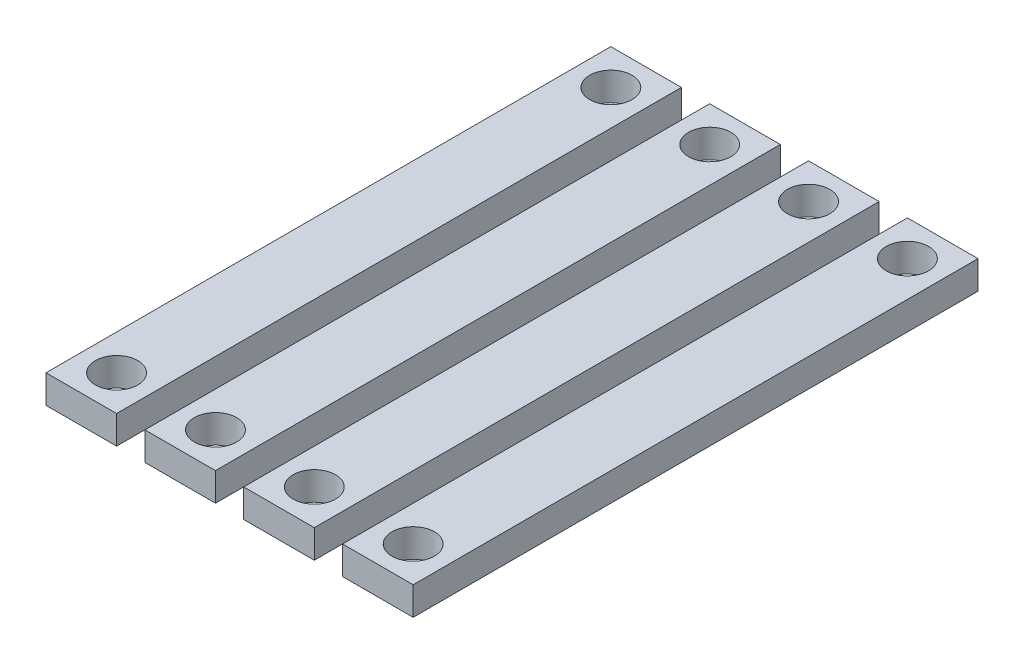
ISO-10303-21;
HEADER;
FILE_DESCRIPTION(('STEP AP214'),'2;1');
FILE_NAME('part.step','',(''),(''),'','','');
FILE_SCHEMA(('AUTOMOTIVE_DESIGN { 1 0 10303 214 1 1 1 1 }'));
ENDSEC;
DATA;
#1=APPLICATION_CONTEXT('core data for automotive mechanical design processes');
#2=APPLICATION_PROTOCOL_DEFINITION('international standard','automotive_design',2000,#1);
#3=PRODUCT_CONTEXT('',#1,'mechanical');
#4=PRODUCT('Part','Part','',(#3));
#5=PRODUCT_RELATED_PRODUCT_CATEGORY('part','',(#4));
#6=PRODUCT_DEFINITION_FORMATION('','',#4);
#7=PRODUCT_DEFINITION_CONTEXT('part definition',#1,'design');
#8=PRODUCT_DEFINITION('design','',#6,#7);
#9=PRODUCT_DEFINITION_SHAPE('','',#8);
#10=(LENGTH_UNIT() NAMED_UNIT(*) SI_UNIT(.MILLI.,.METRE.));
#11=(NAMED_UNIT(*) PLANE_ANGLE_UNIT() SI_UNIT($,.RADIAN.));
#12=(NAMED_UNIT(*) SI_UNIT($,.STERADIAN.) SOLID_ANGLE_UNIT());
#13=UNCERTAINTY_MEASURE_WITH_UNIT(LENGTH_MEASURE(1.E-05),#10,'distance_accuracy_value','');
#14=(GEOMETRIC_REPRESENTATION_CONTEXT(3) GLOBAL_UNCERTAINTY_ASSIGNED_CONTEXT((#13)) GLOBAL_UNIT_ASSIGNED_CONTEXT((#10,
#11,#12)) REPRESENTATION_CONTEXT('',''));
#15=CARTESIAN_POINT('',(0.,0.,0.));
#16=DIRECTION('',(0.,0.,1.));
#17=DIRECTION('',(1.,0.,0.));
#18=AXIS2_PLACEMENT_3D('',#15,#16,#17);
#19=CARTESIAN_POINT('',(21.,2.,0.));
#20=DIRECTION('',(0.,-1.,0.));
#21=DIRECTION('',(0.,0.,-1.));
#22=AXIS2_PLACEMENT_3D('',#19,#20,#21);
#23=PLANE('',#22);
#24=DIRECTION('',(1.,0.,0.));
#25=VECTOR('',#24,1.);
#26=CARTESIAN_POINT('',(21.,2.,0.));
#27=LINE('',#26,#25);
#28=CARTESIAN_POINT('',(21.,2.,0.));
#29=VERTEX_POINT('',#28);
#30=CARTESIAN_POINT('',(26.,2.,0.));
#31=VERTEX_POINT('',#30);
#32=EDGE_CURVE('E137',#29,#31,#27,.T.);
#33=ORIENTED_EDGE('',*,*,#32,.F.);
#34=DIRECTION('',(0.,0.,1.));
#35=VECTOR('',#34,1.);
#36=CARTESIAN_POINT('',(21.,2.,0.));
#37=LINE('',#36,#35);
#38=CARTESIAN_POINT('',(21.,2.,40.));
#39=VERTEX_POINT('',#38);
#40=EDGE_CURVE('E127',#29,#39,#37,.T.);
#41=ORIENTED_EDGE('',*,*,#40,.T.);
#42=DIRECTION('',(1.,0.,0.));
#43=VECTOR('',#42,1.);
#44=CARTESIAN_POINT('',(21.,2.,40.));
#45=LINE('',#44,#43);
#46=CARTESIAN_POINT('',(26.,2.,40.));
#47=VERTEX_POINT('',#46);
#48=EDGE_CURVE('E122',#39,#47,#45,.T.);
#49=ORIENTED_EDGE('',*,*,#48,.T.);
#50=DIRECTION('',(0.,0.,1.));
#51=VECTOR('',#50,1.);
#52=CARTESIAN_POINT('',(26.,2.,0.));
#53=LINE('',#52,#51);
#54=EDGE_CURVE('E126',#31,#47,#53,.T.);
#55=ORIENTED_EDGE('',*,*,#54,.F.);
#56=EDGE_LOOP('',(#33,#41,#49,#55));
#57=FACE_BOUND('',#56,.T.);
#58=CARTESIAN_POINT('',(23.5,2.,37.5));
#59=DIRECTION('',(0.,1.,0.));
#60=DIRECTION('',(0.,0.,1.));
#61=AXIS2_PLACEMENT_3D('',#58,#59,#60);
#62=CIRCLE('',#61,1.5);
#63=CARTESIAN_POINT('',(23.5,2.,39.));
#64=VERTEX_POINT('',#63);
#65=EDGE_CURVE('E147',#64,#64,#62,.T.);
#66=ORIENTED_EDGE('',*,*,#65,.F.);
#67=EDGE_LOOP('',(#66));
#68=FACE_BOUND('',#67,.T.);
#69=CARTESIAN_POINT('',(23.5,2.,2.5));
#70=DIRECTION('',(0.,1.,0.));
#71=DIRECTION('',(0.,0.,1.));
#72=AXIS2_PLACEMENT_3D('',#69,#70,#71);
#73=CIRCLE('',#72,1.5);
#74=CARTESIAN_POINT('',(23.5,2.,4.));
#75=VERTEX_POINT('',#74);
#76=EDGE_CURVE('E188',#75,#75,#73,.T.);
#77=ORIENTED_EDGE('',*,*,#76,.F.);
#78=EDGE_LOOP('',(#77));
#79=FACE_BOUND('',#78,.T.);
#80=ADVANCED_FACE('F76',(#57,#68,#79),#23,.F.);
#81=CARTESIAN_POINT('',(21.,0.,0.));
#82=DIRECTION('',(0.,-1.,0.));
#83=DIRECTION('',(0.,0.,-1.));
#84=AXIS2_PLACEMENT_3D('',#81,#82,#83);
#85=PLANE('',#84);
#86=CARTESIAN_POINT('',(23.5,0.,37.5));
#87=DIRECTION('',(0.,1.,0.));
#88=DIRECTION('',(0.,0.,1.));
#89=AXIS2_PLACEMENT_3D('',#86,#87,#88);
#90=CIRCLE('',#89,1.5);
#91=CARTESIAN_POINT('',(23.5,0.,39.));
#92=VERTEX_POINT('',#91);
#93=EDGE_CURVE('E187',#92,#92,#90,.T.);
#94=ORIENTED_EDGE('',*,*,#93,.T.);
#95=EDGE_LOOP('',(#94));
#96=FACE_BOUND('',#95,.T.);
#97=DIRECTION('',(1.,0.,0.));
#98=VECTOR('',#97,1.);
#99=CARTESIAN_POINT('',(21.,0.,0.));
#100=LINE('',#99,#98);
#101=CARTESIAN_POINT('',(21.,0.,0.));
#102=VERTEX_POINT('',#101);
#103=CARTESIAN_POINT('',(26.,0.,0.));
#104=VERTEX_POINT('',#103);
#105=EDGE_CURVE('E143',#102,#104,#100,.T.);
#106=ORIENTED_EDGE('',*,*,#105,.T.);
#107=DIRECTION('',(0.,0.,1.));
#108=VECTOR('',#107,1.);
#109=CARTESIAN_POINT('',(26.,0.,0.));
#110=LINE('',#109,#108);
#111=CARTESIAN_POINT('',(26.,0.,40.));
#112=VERTEX_POINT('',#111);
#113=EDGE_CURVE('E146',#104,#112,#110,.T.);
#114=ORIENTED_EDGE('',*,*,#113,.T.);
#115=DIRECTION('',(1.,0.,0.));
#116=VECTOR('',#115,1.);
#117=CARTESIAN_POINT('',(21.,0.,40.));
#118=LINE('',#117,#116);
#119=CARTESIAN_POINT('',(21.,0.,40.));
#120=VERTEX_POINT('',#119);
#121=EDGE_CURVE('E134',#120,#112,#118,.T.);
#122=ORIENTED_EDGE('',*,*,#121,.F.);
#123=DIRECTION('',(0.,0.,1.));
#124=VECTOR('',#123,1.);
#125=CARTESIAN_POINT('',(21.,0.,0.));
#126=LINE('',#125,#124);
#127=EDGE_CURVE('E110',#102,#120,#126,.T.);
#128=ORIENTED_EDGE('',*,*,#127,.F.);
#129=EDGE_LOOP('',(#106,#114,#122,#128));
#130=FACE_BOUND('',#129,.T.);
#131=CARTESIAN_POINT('',(23.5,0.,2.5));
#132=DIRECTION('',(0.,1.,0.));
#133=DIRECTION('',(0.,0.,1.));
#134=AXIS2_PLACEMENT_3D('',#131,#132,#133);
#135=CIRCLE('',#134,1.5);
#136=CARTESIAN_POINT('',(23.5,0.,4.));
#137=VERTEX_POINT('',#136);
#138=EDGE_CURVE('E191',#137,#137,#135,.T.);
#139=ORIENTED_EDGE('',*,*,#138,.T.);
#140=EDGE_LOOP('',(#139));
#141=FACE_BOUND('',#140,.T.);
#142=ADVANCED_FACE('F152',(#96,#130,#141),#85,.T.);
#143=CARTESIAN_POINT('',(21.,2.,0.));
#144=DIRECTION('',(0.,0.,-1.));
#145=DIRECTION('',(-1.,0.,0.));
#146=AXIS2_PLACEMENT_3D('',#143,#144,#145);
#147=PLANE('',#146);
#148=ORIENTED_EDGE('',*,*,#105,.F.);
#149=DIRECTION('',(0.,-1.,0.));
#150=VECTOR('',#149,1.);
#151=CARTESIAN_POINT('',(21.,2.,0.));
#152=LINE('',#151,#150);
#153=EDGE_CURVE('E13',#29,#102,#152,.T.);
#154=ORIENTED_EDGE('',*,*,#153,.F.);
#155=ORIENTED_EDGE('',*,*,#32,.T.);
#156=DIRECTION('',(0.,-1.,0.));
#157=VECTOR('',#156,1.);
#158=CARTESIAN_POINT('',(26.,2.,0.));
#159=LINE('',#158,#157);
#160=EDGE_CURVE('E80',#31,#104,#159,.T.);
#161=ORIENTED_EDGE('',*,*,#160,.T.);
#162=EDGE_LOOP('',(#148,#154,#155,#161));
#163=FACE_BOUND('',#162,.T.);
#164=ADVANCED_FACE('F78',(#163),#147,.T.);
#165=CARTESIAN_POINT('',(21.,2.,0.));
#166=DIRECTION('',(1.,0.,0.));
#167=DIRECTION('',(0.,0.,-1.));
#168=AXIS2_PLACEMENT_3D('',#165,#166,#167);
#169=PLANE('',#168);
#170=ORIENTED_EDGE('',*,*,#127,.T.);
#171=DIRECTION('',(0.,-1.,0.));
#172=VECTOR('',#171,1.);
#173=CARTESIAN_POINT('',(21.,2.,40.));
#174=LINE('',#173,#172);
#175=EDGE_CURVE('E86',#39,#120,#174,.T.);
#176=ORIENTED_EDGE('',*,*,#175,.F.);
#177=ORIENTED_EDGE('',*,*,#40,.F.);
#178=ORIENTED_EDGE('',*,*,#153,.T.);
#179=EDGE_LOOP('',(#170,#176,#177,#178));
#180=FACE_BOUND('',#179,.T.);
#181=ADVANCED_FACE('F155',(#180),#169,.F.);
#182=CARTESIAN_POINT('',(21.,2.,40.));
#183=DIRECTION('',(0.,0.,-1.));
#184=DIRECTION('',(-1.,0.,0.));
#185=AXIS2_PLACEMENT_3D('',#182,#183,#184);
#186=PLANE('',#185);
#187=ORIENTED_EDGE('',*,*,#121,.T.);
#188=DIRECTION('',(0.,-1.,0.));
#189=VECTOR('',#188,1.);
#190=CARTESIAN_POINT('',(26.,2.,40.));
#191=LINE('',#190,#189);
#192=EDGE_CURVE('E131',#47,#112,#191,.T.);
#193=ORIENTED_EDGE('',*,*,#192,.F.);
#194=ORIENTED_EDGE('',*,*,#48,.F.);
#195=ORIENTED_EDGE('',*,*,#175,.T.);
#196=EDGE_LOOP('',(#187,#193,#194,#195));
#197=FACE_BOUND('',#196,.T.);
#198=ADVANCED_FACE('F132',(#197),#186,.F.);
#199=CARTESIAN_POINT('',(26.,2.,0.));
#200=DIRECTION('',(1.,0.,0.));
#201=DIRECTION('',(0.,0.,-1.));
#202=AXIS2_PLACEMENT_3D('',#199,#200,#201);
#203=PLANE('',#202);
#204=ORIENTED_EDGE('',*,*,#113,.F.);
#205=ORIENTED_EDGE('',*,*,#160,.F.);
#206=ORIENTED_EDGE('',*,*,#54,.T.);
#207=ORIENTED_EDGE('',*,*,#192,.T.);
#208=EDGE_LOOP('',(#204,#205,#206,#207));
#209=FACE_BOUND('',#208,.T.);
#210=ADVANCED_FACE('F136',(#209),#203,.T.);
#211=CARTESIAN_POINT('',(23.5,2.,37.5));
#212=DIRECTION('',(0.,-1.,0.));
#213=DIRECTION('',(0.,0.,-1.));
#214=AXIS2_PLACEMENT_3D('',#211,#212,#213);
#215=CYLINDRICAL_SURFACE('',#214,1.5);
#216=ORIENTED_EDGE('',*,*,#65,.T.);
#217=EDGE_LOOP('',(#216));
#218=FACE_BOUND('',#217,.T.);
#219=ORIENTED_EDGE('',*,*,#93,.F.);
#220=EDGE_LOOP('',(#219));
#221=FACE_BOUND('',#220,.T.);
#222=ADVANCED_FACE('F168',(#218,#221),#215,.F.);
#223=CARTESIAN_POINT('',(23.5,2.,2.5));
#224=DIRECTION('',(0.,-1.,0.));
#225=DIRECTION('',(0.,0.,-1.));
#226=AXIS2_PLACEMENT_3D('',#223,#224,#225);
#227=CYLINDRICAL_SURFACE('',#226,1.5);
#228=ORIENTED_EDGE('',*,*,#76,.T.);
#229=EDGE_LOOP('',(#228));
#230=FACE_BOUND('',#229,.T.);
#231=ORIENTED_EDGE('',*,*,#138,.F.);
#232=EDGE_LOOP('',(#231));
#233=FACE_BOUND('',#232,.T.);
#234=ADVANCED_FACE('F176',(#230,#233),#227,.F.);
#235=CLOSED_SHELL('',(#80,#142,#164,#181,#198,#210,#222,#234));
#236=MANIFOLD_SOLID_BREP('B2',#235);
#237=CARTESIAN_POINT('',(14.,2.,0.));
#238=DIRECTION('',(0.,-1.,0.));
#239=DIRECTION('',(0.,0.,-1.));
#240=AXIS2_PLACEMENT_3D('',#237,#238,#239);
#241=PLANE('',#240);
#242=DIRECTION('',(1.,0.,0.));
#243=VECTOR('',#242,1.);
#244=CARTESIAN_POINT('',(14.,2.,0.));
#245=LINE('',#244,#243);
#246=CARTESIAN_POINT('',(14.,2.,0.));
#247=VERTEX_POINT('',#246);
#248=CARTESIAN_POINT('',(19.,2.,0.));
#249=VERTEX_POINT('',#248);
#250=EDGE_CURVE('E313',#247,#249,#245,.T.);
#251=ORIENTED_EDGE('',*,*,#250,.F.);
#252=DIRECTION('',(0.,0.,1.));
#253=VECTOR('',#252,1.);
#254=CARTESIAN_POINT('',(14.,2.,0.));
#255=LINE('',#254,#253);
#256=CARTESIAN_POINT('',(14.,2.,40.));
#257=VERTEX_POINT('',#256);
#258=EDGE_CURVE('E303',#247,#257,#255,.T.);
#259=ORIENTED_EDGE('',*,*,#258,.T.);
#260=DIRECTION('',(1.,0.,0.));
#261=VECTOR('',#260,1.);
#262=CARTESIAN_POINT('',(14.,2.,40.));
#263=LINE('',#262,#261);
#264=CARTESIAN_POINT('',(19.,2.,40.));
#265=VERTEX_POINT('',#264);
#266=EDGE_CURVE('E298',#257,#265,#263,.T.);
#267=ORIENTED_EDGE('',*,*,#266,.T.);
#268=DIRECTION('',(0.,0.,1.));
#269=VECTOR('',#268,1.);
#270=CARTESIAN_POINT('',(19.,2.,0.));
#271=LINE('',#270,#269);
#272=EDGE_CURVE('E302',#249,#265,#271,.T.);
#273=ORIENTED_EDGE('',*,*,#272,.F.);
#274=EDGE_LOOP('',(#251,#259,#267,#273));
#275=FACE_BOUND('',#274,.T.);
#276=CARTESIAN_POINT('',(16.5,2.,37.5));
#277=DIRECTION('',(0.,1.,0.));
#278=DIRECTION('',(0.,0.,1.));
#279=AXIS2_PLACEMENT_3D('',#276,#277,#278);
#280=CIRCLE('',#279,1.5);
#281=CARTESIAN_POINT('',(16.5,2.,39.));
#282=VERTEX_POINT('',#281);
#283=EDGE_CURVE('E323',#282,#282,#280,.T.);
#284=ORIENTED_EDGE('',*,*,#283,.F.);
#285=EDGE_LOOP('',(#284));
#286=FACE_BOUND('',#285,.T.);
#287=CARTESIAN_POINT('',(16.5,2.,2.5));
#288=DIRECTION('',(0.,1.,0.));
#289=DIRECTION('',(0.,0.,1.));
#290=AXIS2_PLACEMENT_3D('',#287,#288,#289);
#291=CIRCLE('',#290,1.5);
#292=CARTESIAN_POINT('',(16.5,2.,4.));
#293=VERTEX_POINT('',#292);
#294=EDGE_CURVE('E364',#293,#293,#291,.T.);
#295=ORIENTED_EDGE('',*,*,#294,.F.);
#296=EDGE_LOOP('',(#295));
#297=FACE_BOUND('',#296,.T.);
#298=ADVANCED_FACE('F252',(#275,#286,#297),#241,.F.);
#299=CARTESIAN_POINT('',(14.,0.,0.));
#300=DIRECTION('',(0.,-1.,0.));
#301=DIRECTION('',(0.,0.,-1.));
#302=AXIS2_PLACEMENT_3D('',#299,#300,#301);
#303=PLANE('',#302);
#304=CARTESIAN_POINT('',(16.5,0.,37.5));
#305=DIRECTION('',(0.,1.,0.));
#306=DIRECTION('',(0.,0.,1.));
#307=AXIS2_PLACEMENT_3D('',#304,#305,#306);
#308=CIRCLE('',#307,1.5);
#309=CARTESIAN_POINT('',(16.5,0.,39.));
#310=VERTEX_POINT('',#309);
#311=EDGE_CURVE('E363',#310,#310,#308,.T.);
#312=ORIENTED_EDGE('',*,*,#311,.T.);
#313=EDGE_LOOP('',(#312));
#314=FACE_BOUND('',#313,.T.);
#315=DIRECTION('',(1.,0.,0.));
#316=VECTOR('',#315,1.);
#317=CARTESIAN_POINT('',(14.,0.,0.));
#318=LINE('',#317,#316);
#319=CARTESIAN_POINT('',(14.,0.,0.));
#320=VERTEX_POINT('',#319);
#321=CARTESIAN_POINT('',(19.,0.,0.));
#322=VERTEX_POINT('',#321);
#323=EDGE_CURVE('E319',#320,#322,#318,.T.);
#324=ORIENTED_EDGE('',*,*,#323,.T.);
#325=DIRECTION('',(0.,0.,1.));
#326=VECTOR('',#325,1.);
#327=CARTESIAN_POINT('',(19.,0.,0.));
#328=LINE('',#327,#326);
#329=CARTESIAN_POINT('',(19.,0.,40.));
#330=VERTEX_POINT('',#329);
#331=EDGE_CURVE('E322',#322,#330,#328,.T.);
#332=ORIENTED_EDGE('',*,*,#331,.T.);
#333=DIRECTION('',(1.,0.,0.));
#334=VECTOR('',#333,1.);
#335=CARTESIAN_POINT('',(14.,0.,40.));
#336=LINE('',#335,#334);
#337=CARTESIAN_POINT('',(14.,0.,40.));
#338=VERTEX_POINT('',#337);
#339=EDGE_CURVE('E310',#338,#330,#336,.T.);
#340=ORIENTED_EDGE('',*,*,#339,.F.);
#341=DIRECTION('',(0.,0.,1.));
#342=VECTOR('',#341,1.);
#343=CARTESIAN_POINT('',(14.,0.,0.));
#344=LINE('',#343,#342);
#345=EDGE_CURVE('E286',#320,#338,#344,.T.);
#346=ORIENTED_EDGE('',*,*,#345,.F.);
#347=EDGE_LOOP('',(#324,#332,#340,#346));
#348=FACE_BOUND('',#347,.T.);
#349=CARTESIAN_POINT('',(16.5,0.,2.5));
#350=DIRECTION('',(0.,1.,0.));
#351=DIRECTION('',(0.,0.,1.));
#352=AXIS2_PLACEMENT_3D('',#349,#350,#351);
#353=CIRCLE('',#352,1.5);
#354=CARTESIAN_POINT('',(16.5,0.,4.));
#355=VERTEX_POINT('',#354);
#356=EDGE_CURVE('E367',#355,#355,#353,.T.);
#357=ORIENTED_EDGE('',*,*,#356,.T.);
#358=EDGE_LOOP('',(#357));
#359=FACE_BOUND('',#358,.T.);
#360=ADVANCED_FACE('F328',(#314,#348,#359),#303,.T.);
#361=CARTESIAN_POINT('',(14.,2.,0.));
#362=DIRECTION('',(0.,0.,-1.));
#363=DIRECTION('',(-1.,0.,0.));
#364=AXIS2_PLACEMENT_3D('',#361,#362,#363);
#365=PLANE('',#364);
#366=ORIENTED_EDGE('',*,*,#323,.F.);
#367=DIRECTION('',(0.,-1.,0.));
#368=VECTOR('',#367,1.);
#369=CARTESIAN_POINT('',(14.,2.,0.));
#370=LINE('',#369,#368);
#371=EDGE_CURVE('E74',#247,#320,#370,.T.);
#372=ORIENTED_EDGE('',*,*,#371,.F.);
#373=ORIENTED_EDGE('',*,*,#250,.T.);
#374=DIRECTION('',(0.,-1.,0.));
#375=VECTOR('',#374,1.);
#376=CARTESIAN_POINT('',(19.,2.,0.));
#377=LINE('',#376,#375);
#378=EDGE_CURVE('E256',#249,#322,#377,.T.);
#379=ORIENTED_EDGE('',*,*,#378,.T.);
#380=EDGE_LOOP('',(#366,#372,#373,#379));
#381=FACE_BOUND('',#380,.T.);
#382=ADVANCED_FACE('F254',(#381),#365,.T.);
#383=CARTESIAN_POINT('',(14.,2.,0.));
#384=DIRECTION('',(1.,0.,0.));
#385=DIRECTION('',(0.,0.,-1.));
#386=AXIS2_PLACEMENT_3D('',#383,#384,#385);
#387=PLANE('',#386);
#388=ORIENTED_EDGE('',*,*,#345,.T.);
#389=DIRECTION('',(0.,-1.,0.));
#390=VECTOR('',#389,1.);
#391=CARTESIAN_POINT('',(14.,2.,40.));
#392=LINE('',#391,#390);
#393=EDGE_CURVE('E262',#257,#338,#392,.T.);
#394=ORIENTED_EDGE('',*,*,#393,.F.);
#395=ORIENTED_EDGE('',*,*,#258,.F.);
#396=ORIENTED_EDGE('',*,*,#371,.T.);
#397=EDGE_LOOP('',(#388,#394,#395,#396));
#398=FACE_BOUND('',#397,.T.);
#399=ADVANCED_FACE('F331',(#398),#387,.F.);
#400=CARTESIAN_POINT('',(14.,2.,40.));
#401=DIRECTION('',(0.,0.,-1.));
#402=DIRECTION('',(-1.,0.,0.));
#403=AXIS2_PLACEMENT_3D('',#400,#401,#402);
#404=PLANE('',#403);
#405=ORIENTED_EDGE('',*,*,#339,.T.);
#406=DIRECTION('',(0.,-1.,0.));
#407=VECTOR('',#406,1.);
#408=CARTESIAN_POINT('',(19.,2.,40.));
#409=LINE('',#408,#407);
#410=EDGE_CURVE('E307',#265,#330,#409,.T.);
#411=ORIENTED_EDGE('',*,*,#410,.F.);
#412=ORIENTED_EDGE('',*,*,#266,.F.);
#413=ORIENTED_EDGE('',*,*,#393,.T.);
#414=EDGE_LOOP('',(#405,#411,#412,#413));
#415=FACE_BOUND('',#414,.T.);
#416=ADVANCED_FACE('F308',(#415),#404,.F.);
#417=CARTESIAN_POINT('',(19.,2.,0.));
#418=DIRECTION('',(1.,0.,0.));
#419=DIRECTION('',(0.,0.,-1.));
#420=AXIS2_PLACEMENT_3D('',#417,#418,#419);
#421=PLANE('',#420);
#422=ORIENTED_EDGE('',*,*,#331,.F.);
#423=ORIENTED_EDGE('',*,*,#378,.F.);
#424=ORIENTED_EDGE('',*,*,#272,.T.);
#425=ORIENTED_EDGE('',*,*,#410,.T.);
#426=EDGE_LOOP('',(#422,#423,#424,#425));
#427=FACE_BOUND('',#426,.T.);
#428=ADVANCED_FACE('F312',(#427),#421,.T.);
#429=CARTESIAN_POINT('',(16.5,2.,37.5));
#430=DIRECTION('',(0.,-1.,0.));
#431=DIRECTION('',(0.,0.,-1.));
#432=AXIS2_PLACEMENT_3D('',#429,#430,#431);
#433=CYLINDRICAL_SURFACE('',#432,1.5);
#434=ORIENTED_EDGE('',*,*,#283,.T.);
#435=EDGE_LOOP('',(#434));
#436=FACE_BOUND('',#435,.T.);
#437=ORIENTED_EDGE('',*,*,#311,.F.);
#438=EDGE_LOOP('',(#437));
#439=FACE_BOUND('',#438,.T.);
#440=ADVANCED_FACE('F344',(#436,#439),#433,.F.);
#441=CARTESIAN_POINT('',(16.5,2.,2.5));
#442=DIRECTION('',(0.,-1.,0.));
#443=DIRECTION('',(0.,0.,-1.));
#444=AXIS2_PLACEMENT_3D('',#441,#442,#443);
#445=CYLINDRICAL_SURFACE('',#444,1.5);
#446=ORIENTED_EDGE('',*,*,#294,.T.);
#447=EDGE_LOOP('',(#446));
#448=FACE_BOUND('',#447,.T.);
#449=ORIENTED_EDGE('',*,*,#356,.F.);
#450=EDGE_LOOP('',(#449));
#451=FACE_BOUND('',#450,.T.);
#452=ADVANCED_FACE('F352',(#448,#451),#445,.F.);
#453=CLOSED_SHELL('',(#298,#360,#382,#399,#416,#428,#440,#452));
#454=MANIFOLD_SOLID_BREP('B7',#453);
#455=CARTESIAN_POINT('',(7.,2.,0.));
#456=DIRECTION('',(0.,-1.,0.));
#457=DIRECTION('',(0.,0.,-1.));
#458=AXIS2_PLACEMENT_3D('',#455,#456,#457);
#459=PLANE('',#458);
#460=DIRECTION('',(1.,0.,0.));
#461=VECTOR('',#460,1.);
#462=CARTESIAN_POINT('',(7.,2.,0.));
#463=LINE('',#462,#461);
#464=CARTESIAN_POINT('',(7.,2.,0.));
#465=VERTEX_POINT('',#464);
#466=CARTESIAN_POINT('',(12.,2.,0.));
#467=VERTEX_POINT('',#466);
#468=EDGE_CURVE('E488',#465,#467,#463,.T.);
#469=ORIENTED_EDGE('',*,*,#468,.F.);
#470=DIRECTION('',(0.,0.,1.));
#471=VECTOR('',#470,1.);
#472=CARTESIAN_POINT('',(7.,2.,0.));
#473=LINE('',#472,#471);
#474=CARTESIAN_POINT('',(7.,2.,40.));
#475=VERTEX_POINT('',#474);
#476=EDGE_CURVE('E478',#465,#475,#473,.T.);
#477=ORIENTED_EDGE('',*,*,#476,.T.);
#478=DIRECTION('',(1.,0.,0.));
#479=VECTOR('',#478,1.);
#480=CARTESIAN_POINT('',(7.,2.,40.));
#481=LINE('',#480,#479);
#482=CARTESIAN_POINT('',(12.,2.,40.));
#483=VERTEX_POINT('',#482);
#484=EDGE_CURVE('E473',#475,#483,#481,.T.);
#485=ORIENTED_EDGE('',*,*,#484,.T.);
#486=DIRECTION('',(0.,0.,1.));
#487=VECTOR('',#486,1.);
#488=CARTESIAN_POINT('',(12.,2.,0.));
#489=LINE('',#488,#487);
#490=EDGE_CURVE('E477',#467,#483,#489,.T.);
#491=ORIENTED_EDGE('',*,*,#490,.F.);
#492=EDGE_LOOP('',(#469,#477,#485,#491));
#493=FACE_BOUND('',#492,.T.);
#494=CARTESIAN_POINT('',(9.50000000000001,2.,37.5));
#495=DIRECTION('',(0.,1.,0.));
#496=DIRECTION('',(0.,0.,1.));
#497=AXIS2_PLACEMENT_3D('',#494,#495,#496);
#498=CIRCLE('',#497,1.5);
#499=CARTESIAN_POINT('',(9.50000000000001,2.,39.));
#500=VERTEX_POINT('',#499);
#501=EDGE_CURVE('E498',#500,#500,#498,.T.);
#502=ORIENTED_EDGE('',*,*,#501,.F.);
#503=EDGE_LOOP('',(#502));
#504=FACE_BOUND('',#503,.T.);
#505=CARTESIAN_POINT('',(9.50000000000001,2.,2.5));
#506=DIRECTION('',(0.,1.,0.));
#507=DIRECTION('',(0.,0.,1.));
#508=AXIS2_PLACEMENT_3D('',#505,#506,#507);
#509=CIRCLE('',#508,1.5);
#510=CARTESIAN_POINT('',(9.50000000000001,2.,4.));
#511=VERTEX_POINT('',#510);
#512=EDGE_CURVE('E539',#511,#511,#509,.T.);
#513=ORIENTED_EDGE('',*,*,#512,.F.);
#514=EDGE_LOOP('',(#513));
#515=FACE_BOUND('',#514,.T.);
#516=ADVANCED_FACE('F427',(#493,#504,#515),#459,.F.);
#517=CARTESIAN_POINT('',(7.,0.,0.));
#518=DIRECTION('',(0.,-1.,0.));
#519=DIRECTION('',(0.,0.,-1.));
#520=AXIS2_PLACEMENT_3D('',#517,#518,#519);
#521=PLANE('',#520);
#522=CARTESIAN_POINT('',(9.50000000000001,0.,37.5));
#523=DIRECTION('',(0.,1.,0.));
#524=DIRECTION('',(0.,0.,1.));
#525=AXIS2_PLACEMENT_3D('',#522,#523,#524);
#526=CIRCLE('',#525,1.5);
#527=CARTESIAN_POINT('',(9.50000000000001,0.,39.));
#528=VERTEX_POINT('',#527);
#529=EDGE_CURVE('E538',#528,#528,#526,.T.);
#530=ORIENTED_EDGE('',*,*,#529,.T.);
#531=EDGE_LOOP('',(#530));
#532=FACE_BOUND('',#531,.T.);
#533=DIRECTION('',(1.,0.,0.));
#534=VECTOR('',#533,1.);
#535=CARTESIAN_POINT('',(7.,0.,0.));
#536=LINE('',#535,#534);
#537=CARTESIAN_POINT('',(7.,0.,0.));
#538=VERTEX_POINT('',#537);
#539=CARTESIAN_POINT('',(12.,0.,0.));
#540=VERTEX_POINT('',#539);
#541=EDGE_CURVE('E494',#538,#540,#536,.T.);
#542=ORIENTED_EDGE('',*,*,#541,.T.);
#543=DIRECTION('',(0.,0.,1.));
#544=VECTOR('',#543,1.);
#545=CARTESIAN_POINT('',(12.,0.,0.));
#546=LINE('',#545,#544);
#547=CARTESIAN_POINT('',(12.,0.,40.));
#548=VERTEX_POINT('',#547);
#549=EDGE_CURVE('E497',#540,#548,#546,.T.);
#550=ORIENTED_EDGE('',*,*,#549,.T.);
#551=DIRECTION('',(1.,0.,0.));
#552=VECTOR('',#551,1.);
#553=CARTESIAN_POINT('',(7.,0.,40.));
#554=LINE('',#553,#552);
#555=CARTESIAN_POINT('',(7.,0.,40.));
#556=VERTEX_POINT('',#555);
#557=EDGE_CURVE('E485',#556,#548,#554,.T.);
#558=ORIENTED_EDGE('',*,*,#557,.F.);
#559=DIRECTION('',(0.,0.,1.));
#560=VECTOR('',#559,1.);
#561=CARTESIAN_POINT('',(7.,0.,0.));
#562=LINE('',#561,#560);
#563=EDGE_CURVE('E461',#538,#556,#562,.T.);
#564=ORIENTED_EDGE('',*,*,#563,.F.);
#565=EDGE_LOOP('',(#542,#550,#558,#564));
#566=FACE_BOUND('',#565,.T.);
#567=CARTESIAN_POINT('',(9.50000000000001,0.,2.5));
#568=DIRECTION('',(0.,1.,0.));
#569=DIRECTION('',(0.,0.,1.));
#570=AXIS2_PLACEMENT_3D('',#567,#568,#569);
#571=CIRCLE('',#570,1.5);
#572=CARTESIAN_POINT('',(9.50000000000001,0.,4.));
#573=VERTEX_POINT('',#572);
#574=EDGE_CURVE('E542',#573,#573,#571,.T.);
#575=ORIENTED_EDGE('',*,*,#574,.T.);
#576=EDGE_LOOP('',(#575));
#577=FACE_BOUND('',#576,.T.);
#578=ADVANCED_FACE('F503',(#532,#566,#577),#521,.T.);
#579=CARTESIAN_POINT('',(7.,2.,0.));
#580=DIRECTION('',(0.,0.,-1.));
#581=DIRECTION('',(-1.,0.,0.));
#582=AXIS2_PLACEMENT_3D('',#579,#580,#581);
#583=PLANE('',#582);
#584=ORIENTED_EDGE('',*,*,#541,.F.);
#585=DIRECTION('',(0.,-1.,0.));
#586=VECTOR('',#585,1.);
#587=CARTESIAN_POINT('',(7.,2.,0.));
#588=LINE('',#587,#586);
#589=EDGE_CURVE('E250',#465,#538,#588,.T.);
#590=ORIENTED_EDGE('',*,*,#589,.F.);
#591=ORIENTED_EDGE('',*,*,#468,.T.);
#592=DIRECTION('',(0.,-1.,0.));
#593=VECTOR('',#592,1.);
#594=CARTESIAN_POINT('',(12.,2.,0.));
#595=LINE('',#594,#593);
#596=EDGE_CURVE('E431',#467,#540,#595,.T.);
#597=ORIENTED_EDGE('',*,*,#596,.T.);
#598=EDGE_LOOP('',(#584,#590,#591,#597));
#599=FACE_BOUND('',#598,.T.);
#600=ADVANCED_FACE('F429',(#599),#583,.T.);
#601=CARTESIAN_POINT('',(7.,2.,0.));
#602=DIRECTION('',(1.,0.,0.));
#603=DIRECTION('',(0.,0.,-1.));
#604=AXIS2_PLACEMENT_3D('',#601,#602,#603);
#605=PLANE('',#604);
#606=ORIENTED_EDGE('',*,*,#563,.T.);
#607=DIRECTION('',(0.,-1.,0.));
#608=VECTOR('',#607,1.);
#609=CARTESIAN_POINT('',(7.,2.,40.));
#610=LINE('',#609,#608);
#611=EDGE_CURVE('E437',#475,#556,#610,.T.);
#612=ORIENTED_EDGE('',*,*,#611,.F.);
#613=ORIENTED_EDGE('',*,*,#476,.F.);
#614=ORIENTED_EDGE('',*,*,#589,.T.);
#615=EDGE_LOOP('',(#606,#612,#613,#614));
#616=FACE_BOUND('',#615,.T.);
#617=ADVANCED_FACE('F506',(#616),#605,.F.);
#618=CARTESIAN_POINT('',(7.,2.,40.));
#619=DIRECTION('',(0.,0.,-1.));
#620=DIRECTION('',(-1.,0.,0.));
#621=AXIS2_PLACEMENT_3D('',#618,#619,#620);
#622=PLANE('',#621);
#623=ORIENTED_EDGE('',*,*,#557,.T.);
#624=DIRECTION('',(0.,-1.,0.));
#625=VECTOR('',#624,1.);
#626=CARTESIAN_POINT('',(12.,2.,40.));
#627=LINE('',#626,#625);
#628=EDGE_CURVE('E482',#483,#548,#627,.T.);
#629=ORIENTED_EDGE('',*,*,#628,.F.);
#630=ORIENTED_EDGE('',*,*,#484,.F.);
#631=ORIENTED_EDGE('',*,*,#611,.T.);
#632=EDGE_LOOP('',(#623,#629,#630,#631));
#633=FACE_BOUND('',#632,.T.);
#634=ADVANCED_FACE('F483',(#633),#622,.F.);
#635=CARTESIAN_POINT('',(12.,2.,0.));
#636=DIRECTION('',(1.,0.,0.));
#637=DIRECTION('',(0.,0.,-1.));
#638=AXIS2_PLACEMENT_3D('',#635,#636,#637);
#639=PLANE('',#638);
#640=ORIENTED_EDGE('',*,*,#549,.F.);
#641=ORIENTED_EDGE('',*,*,#596,.F.);
#642=ORIENTED_EDGE('',*,*,#490,.T.);
#643=ORIENTED_EDGE('',*,*,#628,.T.);
#644=EDGE_LOOP('',(#640,#641,#642,#643));
#645=FACE_BOUND('',#644,.T.);
#646=ADVANCED_FACE('F487',(#645),#639,.T.);
#647=CARTESIAN_POINT('',(9.50000000000001,2.,37.5));
#648=DIRECTION('',(0.,-1.,0.));
#649=DIRECTION('',(0.,0.,-1.));
#650=AXIS2_PLACEMENT_3D('',#647,#648,#649);
#651=CYLINDRICAL_SURFACE('',#650,1.5);
#652=ORIENTED_EDGE('',*,*,#501,.T.);
#653=EDGE_LOOP('',(#652));
#654=FACE_BOUND('',#653,.T.);
#655=ORIENTED_EDGE('',*,*,#529,.F.);
#656=EDGE_LOOP('',(#655));
#657=FACE_BOUND('',#656,.T.);
#658=ADVANCED_FACE('F519',(#654,#657),#651,.F.);
#659=CARTESIAN_POINT('',(9.50000000000001,2.,2.5));
#660=DIRECTION('',(0.,-1.,0.));
#661=DIRECTION('',(0.,0.,-1.));
#662=AXIS2_PLACEMENT_3D('',#659,#660,#661);
#663=CYLINDRICAL_SURFACE('',#662,1.5);
#664=ORIENTED_EDGE('',*,*,#512,.T.);
#665=EDGE_LOOP('',(#664));
#666=FACE_BOUND('',#665,.T.);
#667=ORIENTED_EDGE('',*,*,#574,.F.);
#668=EDGE_LOOP('',(#667));
#669=FACE_BOUND('',#668,.T.);
#670=ADVANCED_FACE('F527',(#666,#669),#663,.F.);
#671=CLOSED_SHELL('',(#516,#578,#600,#617,#634,#646,#658,#670));
#672=MANIFOLD_SOLID_BREP('B68',#671);
#673=CARTESIAN_POINT('',(0.,2.,0.));
#674=DIRECTION('',(0.,-1.,0.));
#675=DIRECTION('',(0.,0.,-1.));
#676=AXIS2_PLACEMENT_3D('',#673,#674,#675);
#677=PLANE('',#676);
#678=DIRECTION('',(1.,0.,0.));
#679=VECTOR('',#678,1.);
#680=CARTESIAN_POINT('',(0.,2.,0.));
#681=LINE('',#680,#679);
#682=CARTESIAN_POINT('',(0.,2.,0.));
#683=VERTEX_POINT('',#682);
#684=CARTESIAN_POINT('',(5.00000000000001,2.,0.));
#685=VERTEX_POINT('',#684);
#686=EDGE_CURVE('E654',#683,#685,#681,.T.);
#687=ORIENTED_EDGE('',*,*,#686,.F.);
#688=DIRECTION('',(0.,0.,1.));
#689=VECTOR('',#688,1.);
#690=CARTESIAN_POINT('',(0.,2.,0.));
#691=LINE('',#690,#689);
#692=CARTESIAN_POINT('',(0.,2.,40.));
#693=VERTEX_POINT('',#692);
#694=EDGE_CURVE('E644',#683,#693,#691,.T.);
#695=ORIENTED_EDGE('',*,*,#694,.T.);
#696=DIRECTION('',(1.,0.,0.));
#697=VECTOR('',#696,1.);
#698=CARTESIAN_POINT('',(0.,2.,40.));
#699=LINE('',#698,#697);
#700=CARTESIAN_POINT('',(5.00000000000001,2.,40.));
#701=VERTEX_POINT('',#700);
#702=EDGE_CURVE('E639',#693,#701,#699,.T.);
#703=ORIENTED_EDGE('',*,*,#702,.T.);
#704=DIRECTION('',(0.,0.,1.));
#705=VECTOR('',#704,1.);
#706=CARTESIAN_POINT('',(5.00000000000001,2.,0.));
#707=LINE('',#706,#705);
#708=EDGE_CURVE('E643',#685,#701,#707,.T.);
#709=ORIENTED_EDGE('',*,*,#708,.F.);
#710=EDGE_LOOP('',(#687,#695,#703,#709));
#711=FACE_BOUND('',#710,.T.);
#712=CARTESIAN_POINT('',(2.50000000000001,2.,37.5));
#713=DIRECTION('',(0.,1.,0.));
#714=DIRECTION('',(0.,0.,1.));
#715=AXIS2_PLACEMENT_3D('',#712,#713,#714);
#716=CIRCLE('',#715,1.5);
#717=CARTESIAN_POINT('',(2.50000000000001,2.,39.));
#718=VERTEX_POINT('',#717);
#719=EDGE_CURVE('E664',#718,#718,#716,.T.);
#720=ORIENTED_EDGE('',*,*,#719,.F.);
#721=EDGE_LOOP('',(#720));
#722=FACE_BOUND('',#721,.T.);
#723=CARTESIAN_POINT('',(2.50000000000001,2.,2.5));
#724=DIRECTION('',(0.,1.,0.));
#725=DIRECTION('',(0.,0.,1.));
#726=AXIS2_PLACEMENT_3D('',#723,#724,#725);
#727=CIRCLE('',#726,1.5);
#728=CARTESIAN_POINT('',(2.50000000000001,2.,4.));
#729=VERTEX_POINT('',#728);
#730=EDGE_CURVE('E705',#729,#729,#727,.T.);
#731=ORIENTED_EDGE('',*,*,#730,.F.);
#732=EDGE_LOOP('',(#731));
#733=FACE_BOUND('',#732,.T.);
#734=ADVANCED_FACE('F593',(#711,#722,#733),#677,.F.);
#735=CARTESIAN_POINT('',(0.,0.,0.));
#736=DIRECTION('',(0.,-1.,0.));
#737=DIRECTION('',(0.,0.,-1.));
#738=AXIS2_PLACEMENT_3D('',#735,#736,#737);
#739=PLANE('',#738);
#740=CARTESIAN_POINT('',(2.50000000000001,0.,37.5));
#741=DIRECTION('',(0.,1.,0.));
#742=DIRECTION('',(0.,0.,1.));
#743=AXIS2_PLACEMENT_3D('',#740,#741,#742);
#744=CIRCLE('',#743,1.5);
#745=CARTESIAN_POINT('',(2.50000000000001,0.,39.));
#746=VERTEX_POINT('',#745);
#747=EDGE_CURVE('E704',#746,#746,#744,.T.);
#748=ORIENTED_EDGE('',*,*,#747,.T.);
#749=EDGE_LOOP('',(#748));
#750=FACE_BOUND('',#749,.T.);
#751=DIRECTION('',(1.,0.,0.));
#752=VECTOR('',#751,1.);
#753=CARTESIAN_POINT('',(0.,0.,0.));
#754=LINE('',#753,#752);
#755=CARTESIAN_POINT('',(0.,0.,0.));
#756=VERTEX_POINT('',#755);
#757=CARTESIAN_POINT('',(5.00000000000001,0.,0.));
#758=VERTEX_POINT('',#757);
#759=EDGE_CURVE('E660',#756,#758,#754,.T.);
#760=ORIENTED_EDGE('',*,*,#759,.T.);
#761=DIRECTION('',(0.,0.,1.));
#762=VECTOR('',#761,1.);
#763=CARTESIAN_POINT('',(5.00000000000001,0.,0.));
#764=LINE('',#763,#762);
#765=CARTESIAN_POINT('',(5.00000000000001,0.,40.));
#766=VERTEX_POINT('',#765);
#767=EDGE_CURVE('E663',#758,#766,#764,.T.);
#768=ORIENTED_EDGE('',*,*,#767,.T.);
#769=DIRECTION('',(1.,0.,0.));
#770=VECTOR('',#769,1.);
#771=CARTESIAN_POINT('',(0.,0.,40.));
#772=LINE('',#771,#770);
#773=CARTESIAN_POINT('',(0.,0.,40.));
#774=VERTEX_POINT('',#773);
#775=EDGE_CURVE('E651',#774,#766,#772,.T.);
#776=ORIENTED_EDGE('',*,*,#775,.F.);
#777=DIRECTION('',(0.,0.,1.));
#778=VECTOR('',#777,1.);
#779=CARTESIAN_POINT('',(0.,0.,0.));
#780=LINE('',#779,#778);
#781=EDGE_CURVE('E627',#756,#774,#780,.T.);
#782=ORIENTED_EDGE('',*,*,#781,.F.);
#783=EDGE_LOOP('',(#760,#768,#776,#782));
#784=FACE_BOUND('',#783,.T.);
#785=CARTESIAN_POINT('',(2.50000000000001,0.,2.5));
#786=DIRECTION('',(0.,1.,0.));
#787=DIRECTION('',(0.,0.,1.));
#788=AXIS2_PLACEMENT_3D('',#785,#786,#787);
#789=CIRCLE('',#788,1.5);
#790=CARTESIAN_POINT('',(2.50000000000001,0.,4.));
#791=VERTEX_POINT('',#790);
#792=EDGE_CURVE('E708',#791,#791,#789,.T.);
#793=ORIENTED_EDGE('',*,*,#792,.T.);
#794=EDGE_LOOP('',(#793));
#795=FACE_BOUND('',#794,.T.);
#796=ADVANCED_FACE('F669',(#750,#784,#795),#739,.T.);
#797=CARTESIAN_POINT('',(0.,2.,0.));
#798=DIRECTION('',(0.,0.,-1.));
#799=DIRECTION('',(-1.,0.,0.));
#800=AXIS2_PLACEMENT_3D('',#797,#798,#799);
#801=PLANE('',#800);
#802=ORIENTED_EDGE('',*,*,#759,.F.);
#803=DIRECTION('',(0.,-1.,0.));
#804=VECTOR('',#803,1.);
#805=CARTESIAN_POINT('',(0.,2.,0.));
#806=LINE('',#805,#804);
#807=EDGE_CURVE('E425',#683,#756,#806,.T.);
#808=ORIENTED_EDGE('',*,*,#807,.F.);
#809=ORIENTED_EDGE('',*,*,#686,.T.);
#810=DIRECTION('',(0.,-1.,0.));
#811=VECTOR('',#810,1.);
#812=CARTESIAN_POINT('',(5.00000000000001,2.,0.));
#813=LINE('',#812,#811);
#814=EDGE_CURVE('E597',#685,#758,#813,.T.);
#815=ORIENTED_EDGE('',*,*,#814,.T.);
#816=EDGE_LOOP('',(#802,#808,#809,#815));
#817=FACE_BOUND('',#816,.T.);
#818=ADVANCED_FACE('F595',(#817),#801,.T.);
#819=CARTESIAN_POINT('',(0.,2.,0.));
#820=DIRECTION('',(1.,0.,0.));
#821=DIRECTION('',(0.,0.,-1.));
#822=AXIS2_PLACEMENT_3D('',#819,#820,#821);
#823=PLANE('',#822);
#824=ORIENTED_EDGE('',*,*,#781,.T.);
#825=DIRECTION('',(0.,-1.,0.));
#826=VECTOR('',#825,1.);
#827=CARTESIAN_POINT('',(0.,2.,40.));
#828=LINE('',#827,#826);
#829=EDGE_CURVE('E603',#693,#774,#828,.T.);
#830=ORIENTED_EDGE('',*,*,#829,.F.);
#831=ORIENTED_EDGE('',*,*,#694,.F.);
#832=ORIENTED_EDGE('',*,*,#807,.T.);
#833=EDGE_LOOP('',(#824,#830,#831,#832));
#834=FACE_BOUND('',#833,.T.);
#835=ADVANCED_FACE('F672',(#834),#823,.F.);
#836=CARTESIAN_POINT('',(0.,2.,40.));
#837=DIRECTION('',(0.,0.,-1.));
#838=DIRECTION('',(-1.,0.,0.));
#839=AXIS2_PLACEMENT_3D('',#836,#837,#838);
#840=PLANE('',#839);
#841=ORIENTED_EDGE('',*,*,#775,.T.);
#842=DIRECTION('',(0.,-1.,0.));
#843=VECTOR('',#842,1.);
#844=CARTESIAN_POINT('',(5.00000000000001,2.,40.));
#845=LINE('',#844,#843);
#846=EDGE_CURVE('E648',#701,#766,#845,.T.);
#847=ORIENTED_EDGE('',*,*,#846,.F.);
#848=ORIENTED_EDGE('',*,*,#702,.F.);
#849=ORIENTED_EDGE('',*,*,#829,.T.);
#850=EDGE_LOOP('',(#841,#847,#848,#849));
#851=FACE_BOUND('',#850,.T.);
#852=ADVANCED_FACE('F649',(#851),#840,.F.);
#853=CARTESIAN_POINT('',(5.00000000000001,2.,0.));
#854=DIRECTION('',(1.,0.,0.));
#855=DIRECTION('',(0.,0.,-1.));
#856=AXIS2_PLACEMENT_3D('',#853,#854,#855);
#857=PLANE('',#856);
#858=ORIENTED_EDGE('',*,*,#767,.F.);
#859=ORIENTED_EDGE('',*,*,#814,.F.);
#860=ORIENTED_EDGE('',*,*,#708,.T.);
#861=ORIENTED_EDGE('',*,*,#846,.T.);
#862=EDGE_LOOP('',(#858,#859,#860,#861));
#863=FACE_BOUND('',#862,.T.);
#864=ADVANCED_FACE('F653',(#863),#857,.T.);
#865=CARTESIAN_POINT('',(2.50000000000001,2.,37.5));
#866=DIRECTION('',(0.,-1.,0.));
#867=DIRECTION('',(0.,0.,-1.));
#868=AXIS2_PLACEMENT_3D('',#865,#866,#867);
#869=CYLINDRICAL_SURFACE('',#868,1.5);
#870=ORIENTED_EDGE('',*,*,#719,.T.);
#871=EDGE_LOOP('',(#870));
#872=FACE_BOUND('',#871,.T.);
#873=ORIENTED_EDGE('',*,*,#747,.F.);
#874=EDGE_LOOP('',(#873));
#875=FACE_BOUND('',#874,.T.);
#876=ADVANCED_FACE('F685',(#872,#875),#869,.F.);
#877=CARTESIAN_POINT('',(2.50000000000001,2.,2.5));
#878=DIRECTION('',(0.,-1.,0.));
#879=DIRECTION('',(0.,0.,-1.));
#880=AXIS2_PLACEMENT_3D('',#877,#878,#879);
#881=CYLINDRICAL_SURFACE('',#880,1.5);
#882=ORIENTED_EDGE('',*,*,#730,.T.);
#883=EDGE_LOOP('',(#882));
#884=FACE_BOUND('',#883,.T.);
#885=ORIENTED_EDGE('',*,*,#792,.F.);
#886=EDGE_LOOP('',(#885));
#887=FACE_BOUND('',#886,.T.);
#888=ADVANCED_FACE('F693',(#884,#887),#881,.F.);
#889=CLOSED_SHELL('',(#734,#796,#818,#835,#852,#864,#876,#888));
#890=MANIFOLD_SOLID_BREP('B244',#889);
#891=ADVANCED_BREP_SHAPE_REPRESENTATION('',(#18,#236,#454,#672,#890),#14);
#892=SHAPE_DEFINITION_REPRESENTATION(#9,#891);
ENDSEC;
END-ISO-10303-21;
